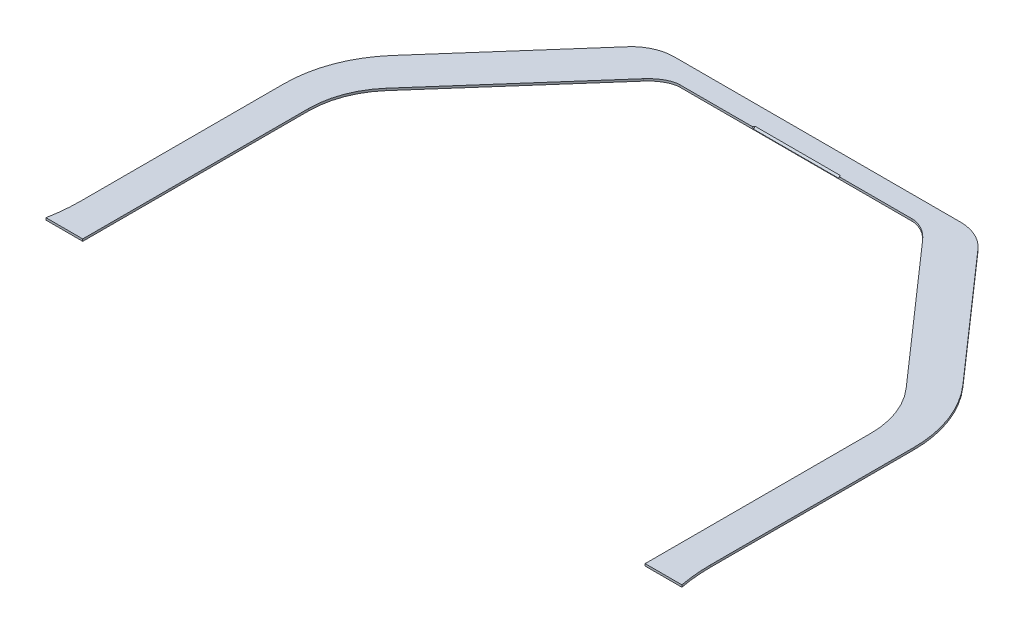
ISO-10303-21;
HEADER;
FILE_DESCRIPTION(('STEP AP214'),'2;1');
FILE_NAME('part.step','',(''),(''),'','','');
FILE_SCHEMA(('AUTOMOTIVE_DESIGN { 1 0 10303 214 1 1 1 1 }'));
ENDSEC;
DATA;
#1=APPLICATION_CONTEXT('core data for automotive mechanical design processes');
#2=APPLICATION_PROTOCOL_DEFINITION('international standard','automotive_design',2000,#1);
#3=PRODUCT_CONTEXT('',#1,'mechanical');
#4=PRODUCT('Part','Part','',(#3));
#5=PRODUCT_RELATED_PRODUCT_CATEGORY('part','',(#4));
#6=PRODUCT_DEFINITION_FORMATION('','',#4);
#7=PRODUCT_DEFINITION_CONTEXT('part definition',#1,'design');
#8=PRODUCT_DEFINITION('design','',#6,#7);
#9=PRODUCT_DEFINITION_SHAPE('','',#8);
#10=(LENGTH_UNIT() NAMED_UNIT(*) SI_UNIT(.MILLI.,.METRE.));
#11=(NAMED_UNIT(*) PLANE_ANGLE_UNIT() SI_UNIT($,.RADIAN.));
#12=(NAMED_UNIT(*) SI_UNIT($,.STERADIAN.) SOLID_ANGLE_UNIT());
#13=UNCERTAINTY_MEASURE_WITH_UNIT(LENGTH_MEASURE(1.E-05),#10,'distance_accuracy_value','');
#14=(GEOMETRIC_REPRESENTATION_CONTEXT(3) GLOBAL_UNCERTAINTY_ASSIGNED_CONTEXT((#13)) GLOBAL_UNIT_ASSIGNED_CONTEXT((#10,
#11,#12)) REPRESENTATION_CONTEXT('',''));
#15=CARTESIAN_POINT('',(0.,0.,0.));
#16=DIRECTION('',(0.,0.,1.));
#17=DIRECTION('',(1.,0.,0.));
#18=AXIS2_PLACEMENT_3D('',#15,#16,#17);
#19=CARTESIAN_POINT('',(136.933846734261,379.769666648598,209.045625837407));
#20=DIRECTION('',(0.707106781186548,-0.499999999999999,-0.5));
#21=DIRECTION('',(-0.577350269189626,0.,-0.816496580927726));
#22=AXIS2_PLACEMENT_3D('',#19,#20,#21);
#23=PLANE('',#22);
#24=DIRECTION('',(-0.577350269188909,0.,-0.816496580928233));
#25=VECTOR('',#24,1.);
#26=CARTESIAN_POINT('',(137.202858372651,376.000087185113,213.19564520834));
#27=LINE('',#26,#25);
#28=CARTESIAN_POINT('',(137.202858372651,376.000087185113,213.19564520834));
#29=VERTEX_POINT('',#28);
#30=CARTESIAN_POINT('',(136.933846734261,376.000087185113,212.815205300892));
#31=VERTEX_POINT('',#30);
#32=EDGE_CURVE('E208',#29,#31,#27,.T.);
#33=ORIENTED_EDGE('',*,*,#32,.T.);
#34=DIRECTION('',(0.,0.707106781186548,-0.707106781186548));
#35=VECTOR('',#34,1.);
#36=CARTESIAN_POINT('',(136.933846734261,379.769666648598,209.045625837407));
#37=LINE('',#36,#35);
#38=CARTESIAN_POINT('',(136.933846734261,375.619647277665,213.19564520834));
#39=VERTEX_POINT('',#38);
#40=EDGE_CURVE('E191',#31,#39,#37,.F.);
#41=ORIENTED_EDGE('',*,*,#40,.T.);
#42=DIRECTION('',(-0.577350269188993,-0.816496580928173,0.));
#43=VECTOR('',#42,1.);
#44=CARTESIAN_POINT('',(137.202858372651,376.000087185113,213.19564520834));
#45=LINE('',#44,#43);
#46=EDGE_CURVE('E194',#29,#39,#45,.T.);
#47=ORIENTED_EDGE('',*,*,#46,.F.);
#48=EDGE_LOOP('',(#33,#41,#47));
#49=FACE_BOUND('',#48,.T.);
#50=ADVANCED_FACE('F17',(#49),#23,.F.);
#51=CARTESIAN_POINT('',(117.066314366113,379.769666648598,209.045625837407));
#52=DIRECTION('',(0.,-0.707106781186548,-0.707106781186548));
#53=DIRECTION('',(0.,0.707106781186548,-0.707106781186548));
#54=AXIS2_PLACEMENT_3D('',#51,#52,#53);
#55=PLANE('',#54);
#56=ORIENTED_EDGE('',*,*,#40,.F.);
#57=DIRECTION('',(1.,0.,0.));
#58=VECTOR('',#57,1.);
#59=CARTESIAN_POINT('',(127.000080550187,376.000087185113,212.815205300892));
#60=LINE('',#59,#58);
#61=CARTESIAN_POINT('',(117.066314366113,376.000087185113,212.815205300892));
#62=VERTEX_POINT('',#61);
#63=EDGE_CURVE('E292',#31,#62,#60,.F.);
#64=ORIENTED_EDGE('',*,*,#63,.T.);
#65=DIRECTION('',(0.,-0.707106781186496,0.707106781186599));
#66=VECTOR('',#65,1.);
#67=CARTESIAN_POINT('',(117.066314366113,376.000087185113,212.815205300892));
#68=LINE('',#67,#66);
#69=CARTESIAN_POINT('',(117.066314366113,375.619647277665,213.19564520834));
#70=VERTEX_POINT('',#69);
#71=EDGE_CURVE('E299',#62,#70,#68,.T.);
#72=ORIENTED_EDGE('',*,*,#71,.T.);
#73=DIRECTION('',(1.,0.,0.));
#74=VECTOR('',#73,1.);
#75=CARTESIAN_POINT('',(154.160725180053,375.619647277665,213.19564520834));
#76=LINE('',#75,#74);
#77=EDGE_CURVE('E288',#39,#70,#76,.F.);
#78=ORIENTED_EDGE('',*,*,#77,.F.);
#79=EDGE_LOOP('',(#56,#64,#72,#78));
#80=FACE_BOUND('',#79,.T.);
#81=ADVANCED_FACE('F476',(#80),#55,.F.);
#82=CARTESIAN_POINT('',(107.90819745815,386.245433217117,215.521392405927));
#83=DIRECTION('',(-0.707106781186547,-0.500000000000001,-0.5));
#84=DIRECTION('',(0.577350269189627,-0.816496580927725,0.));
#85=AXIS2_PLACEMENT_3D('',#82,#83,#84);
#86=PLANE('',#85);
#87=ORIENTED_EDGE('',*,*,#71,.F.);
#88=DIRECTION('',(-0.577350269188929,0.,0.816496580928219));
#89=VECTOR('',#88,1.);
#90=CARTESIAN_POINT('',(117.066314366113,376.000087185113,212.815205300892));
#91=LINE('',#90,#89);
#92=CARTESIAN_POINT('',(116.797302727723,376.000087185113,213.19564520834));
#93=VERTEX_POINT('',#92);
#94=EDGE_CURVE('E175',#62,#93,#91,.T.);
#95=ORIENTED_EDGE('',*,*,#94,.T.);
#96=DIRECTION('',(-0.577350269189013,0.816496580928159,0.));
#97=VECTOR('',#96,1.);
#98=CARTESIAN_POINT('',(117.066314366113,375.619647277665,213.19564520834));
#99=LINE('',#98,#97);
#100=EDGE_CURVE('E277',#70,#93,#99,.T.);
#101=ORIENTED_EDGE('',*,*,#100,.F.);
#102=EDGE_LOOP('',(#87,#95,#101));
#103=FACE_BOUND('',#102,.T.);
#104=ADVANCED_FACE('F473',(#103),#86,.F.);
#105=CARTESIAN_POINT('',(127.000080550187,376.000087185113,280.049829269519));
#106=DIRECTION('',(0.,-1.,0.));
#107=DIRECTION('',(1.,0.,0.));
#108=AXIS2_PLACEMENT_3D('',#105,#106,#107);
#109=PLANE('',#108);
#110=DIRECTION('',(1.,0.,0.));
#111=VECTOR('',#110,1.);
#112=CARTESIAN_POINT('',(154.160725180053,376.000087185113,213.19564520834));
#113=LINE('',#112,#111);
#114=CARTESIAN_POINT('',(154.160725180053,376.000087185113,213.19564520834));
#115=VERTEX_POINT('',#114);
#116=EDGE_CURVE('E212',#115,#29,#113,.F.);
#117=ORIENTED_EDGE('',*,*,#116,.F.);
#118=CARTESIAN_POINT('',(154.160725180053,376.000087185113,213.19564520834));
#119=CARTESIAN_POINT('',(154.262460285647,376.000087185113,213.195657906851));
#120=CARTESIAN_POINT('',(154.364120166583,376.000087185113,213.199601396453));
#121=CARTESIAN_POINT('',(154.566796880058,376.000087185113,213.214611900631));
#122=CARTESIAN_POINT('',(154.667814343037,376.000087185113,213.225670268553));
#123=CARTESIAN_POINT('',(154.967929438156,376.000087185113,213.26820123869));
#124=CARTESIAN_POINT('',(155.165724729044,376.000087185113,213.30905408337));
#125=CARTESIAN_POINT('',(155.540017833539,376.000087185113,213.407121446668));
#126=CARTESIAN_POINT('',(155.716947775557,376.000087185113,213.462752906689));
#127=CARTESIAN_POINT('',(156.065587229689,376.000087185113,213.588648321069));
#128=CARTESIAN_POINT('',(156.237294101393,376.000087185113,213.658919539854));
#129=CARTESIAN_POINT('',(156.576590096595,376.000087185113,213.812687916555));
#130=CARTESIAN_POINT('',(156.744124898625,376.000087185113,213.896303905185));
#131=CARTESIAN_POINT('',(157.073192869577,376.000087185113,214.074622213163));
#132=CARTESIAN_POINT('',(157.234725121922,376.000087185113,214.169326216537));
#133=CARTESIAN_POINT('',(157.535260997122,376.000087185113,214.358230365262));
#134=CARTESIAN_POINT('',(157.67486919109,376.000087185113,214.451473842261));
#135=CARTESIAN_POINT('',(157.949086202793,376.000087185113,214.645115045541));
#136=CARTESIAN_POINT('',(158.083693553515,376.000087185113,214.745514846332));
#137=CARTESIAN_POINT('',(158.347821653437,376.000087185113,214.952873733061));
#138=CARTESIAN_POINT('',(158.477340689966,376.000087185113,215.059834997008));
#139=CARTESIAN_POINT('',(158.728434210269,376.000087185113,215.277448354507));
#140=CARTESIAN_POINT('',(158.850119217999,376.000087185113,215.387973079838));
#141=CARTESIAN_POINT('',(159.088301266345,376.000087185113,215.614370957318));
#142=CARTESIAN_POINT('',(159.204800587149,376.000087185113,215.730241712206));
#143=CARTESIAN_POINT('',(159.432379047297,376.000087185113,215.96693767329));
#144=CARTESIAN_POINT('',(159.543464171324,376.000087185113,216.087757124265));
#145=CARTESIAN_POINT('',(159.651829467432,376.000087185113,216.210962836589));
#146=B_SPLINE_CURVE_WITH_KNOTS('',3,(#118,#119,#120,#121,#122,#123,#124,#125,#126,#127,#128,
#129,#130,#131,#132,#133,#134,#135,#136,#137,#138,#139,#140,#141,#142,#143,#144,#145),
.UNSPECIFIED.,.F.,.F.,(4,2,2,2,2,2,2,2,2,2,2,2,2,4),(0.,0.305010434220096,0.609650890157527,
1.21406500426163,1.76979197699951,2.32579536784298,2.8870586448757,3.4484072763154,
3.95182336903746,4.45538599264022,4.95911668257461,5.45210409213304,5.94487254554009,
6.43708334541167),.UNSPECIFIED.);
#147=CARTESIAN_POINT('',(159.651829467432,376.000087185113,216.210962836589));
#148=VERTEX_POINT('',#147);
#149=EDGE_CURVE('E20',#115,#148,#146,.T.);
#150=ORIENTED_EDGE('',*,*,#149,.T.);
#151=DIRECTION('',(0.660384970753068,0.,0.750927220443812));
#152=VECTOR('',#151,1.);
#153=CARTESIAN_POINT('',(187.818624959063,376.000087185113,248.239574001406));
#154=LINE('',#153,#152);
#155=CARTESIAN_POINT('',(187.818624959063,376.000087185113,248.239574001406));
#156=VERTEX_POINT('',#155);
#157=EDGE_CURVE('E199',#156,#148,#154,.F.);
#158=ORIENTED_EDGE('',*,*,#157,.F.);
#159=CARTESIAN_POINT('',(172.800080550187,376.000087185113,261.447273416467));
#160=DIRECTION('',(0.,-1.,0.));
#161=DIRECTION('',(0.,0.,-1.));
#162=AXIS2_PLACEMENT_3D('',#159,#160,#161);
#163=CIRCLE('',#162,20.);
#164=CARTESIAN_POINT('',(192.800080550187,376.000087185113,261.447273416467));
#165=VERTEX_POINT('',#164);
#166=EDGE_CURVE('E485',#156,#165,#163,.T.);
#167=ORIENTED_EDGE('',*,*,#166,.T.);
#168=DIRECTION('',(0.,0.,1.));
#169=VECTOR('',#168,1.);
#170=CARTESIAN_POINT('',(192.800080550187,376.000087185113,314.303999999904));
#171=LINE('',#170,#169);
#172=CARTESIAN_POINT('',(192.800080550187,376.000087185113,314.303999999904));
#173=VERTEX_POINT('',#172);
#174=EDGE_CURVE('E223',#173,#165,#171,.F.);
#175=ORIENTED_EDGE('',*,*,#174,.F.);
#176=DIRECTION('',(1.,0.,0.));
#177=VECTOR('',#176,1.);
#178=CARTESIAN_POINT('',(201.398389908126,376.000087185113,314.303999999904));
#179=LINE('',#178,#177);
#180=CARTESIAN_POINT('',(201.398389908126,376.000087185113,314.303999999904));
#181=VERTEX_POINT('',#180);
#182=EDGE_CURVE('E229',#181,#173,#179,.F.);
#183=ORIENTED_EDGE('',*,*,#182,.F.);
#184=CARTESIAN_POINT('',(240.700080550187,376.000087185113,306.862420014731));
#185=DIRECTION('',(0.,-1.,0.));
#186=DIRECTION('',(0.,0.,-1.));
#187=AXIS2_PLACEMENT_3D('',#184,#185,#186);
#188=CIRCLE('',#187,40.);
#189=CARTESIAN_POINT('',(200.700080550187,376.000087185113,306.862420014731));
#190=VERTEX_POINT('',#189);
#191=EDGE_CURVE('E232',#181,#190,#188,.T.);
#192=ORIENTED_EDGE('',*,*,#191,.T.);
#193=DIRECTION('',(0.,0.,-1.));
#194=VECTOR('',#193,1.);
#195=CARTESIAN_POINT('',(200.700080550187,376.000087185113,259.327297853723));
#196=LINE('',#195,#194);
#197=CARTESIAN_POINT('',(200.700080550187,376.000087185113,259.327297853723));
#198=VERTEX_POINT('',#197);
#199=EDGE_CURVE('E235',#198,#190,#196,.F.);
#200=ORIENTED_EDGE('',*,*,#199,.F.);
#201=CARTESIAN_POINT('',(172.800080550187,376.000087185113,259.327297853723));
#202=DIRECTION('',(0.,-1.,0.));
#203=DIRECTION('',(0.,0.,-1.));
#204=AXIS2_PLACEMENT_3D('',#201,#202,#203);
#205=CIRCLE('',#204,27.9);
#206=CARTESIAN_POINT('',(193.750950000569,376.000087185113,240.902557169712));
#207=VERTEX_POINT('',#206);
#208=EDGE_CURVE('E502',#207,#198,#205,.T.);
#209=ORIENTED_EDGE('',*,*,#208,.F.);
#210=DIRECTION('',(-0.660384970753068,0.,-0.750927220443812));
#211=VECTOR('',#210,1.);
#212=CARTESIAN_POINT('',(167.974302197033,376.000087185113,211.591795500809));
#213=LINE('',#212,#211);
#214=CARTESIAN_POINT('',(167.974302197033,376.000087185113,211.591795500809));
#215=VERTEX_POINT('',#214);
#216=EDGE_CURVE('E239',#215,#207,#213,.F.);
#217=ORIENTED_EDGE('',*,*,#216,.F.);
#218=CARTESIAN_POINT('',(160.465029992595,376.000087185113,218.19564520834));
#219=DIRECTION('',(0.,-1.,0.));
#220=DIRECTION('',(0.,0.,-1.));
#221=AXIS2_PLACEMENT_3D('',#218,#219,#220);
#222=CIRCLE('',#221,10.0000000000004);
#223=CARTESIAN_POINT('',(160.465029992595,376.000087185113,208.19564520834));
#224=VERTEX_POINT('',#223);
#225=EDGE_CURVE('E507',#224,#215,#222,.T.);
#226=ORIENTED_EDGE('',*,*,#225,.F.);
#227=DIRECTION('',(-1.,0.,0.));
#228=VECTOR('',#227,1.);
#229=CARTESIAN_POINT('',(93.5351311077796,376.000087185113,208.19564520834));
#230=LINE('',#229,#228);
#231=CARTESIAN_POINT('',(93.5351311077796,376.000087185113,208.19564520834));
#232=VERTEX_POINT('',#231);
#233=EDGE_CURVE('E244',#232,#224,#230,.F.);
#234=ORIENTED_EDGE('',*,*,#233,.F.);
#235=CARTESIAN_POINT('',(93.5351311077797,376.000087185113,218.19564520834));
#236=DIRECTION('',(0.,-1.,0.));
#237=DIRECTION('',(0.,0.,-1.));
#238=AXIS2_PLACEMENT_3D('',#235,#236,#237);
#239=CIRCLE('',#238,10.0000000000001);
#240=CARTESIAN_POINT('',(86.0258589033417,376.000087185113,211.591795500809));
#241=VERTEX_POINT('',#240);
#242=EDGE_CURVE('E512',#241,#232,#239,.T.);
#243=ORIENTED_EDGE('',*,*,#242,.F.);
#244=DIRECTION('',(-0.660384970753068,0.,0.750927220443812));
#245=VECTOR('',#244,1.);
#246=CARTESIAN_POINT('',(60.2492110998048,376.000087185113,240.902557169713));
#247=LINE('',#246,#245);
#248=CARTESIAN_POINT('',(60.249211099805,376.000087185113,240.902557169713));
#249=VERTEX_POINT('',#248);
#250=EDGE_CURVE('E249',#249,#241,#247,.F.);
#251=ORIENTED_EDGE('',*,*,#250,.F.);
#252=CARTESIAN_POINT('',(81.2000805501871,376.000087185113,259.327297853723));
#253=DIRECTION('',(0.,-1.,0.));
#254=DIRECTION('',(0.,0.,-1.));
#255=AXIS2_PLACEMENT_3D('',#252,#253,#254);
#256=CIRCLE('',#255,27.9);
#257=CARTESIAN_POINT('',(53.3000805501871,376.000087185113,259.327297853723));
#258=VERTEX_POINT('',#257);
#259=EDGE_CURVE('E517',#258,#249,#256,.T.);
#260=ORIENTED_EDGE('',*,*,#259,.F.);
#261=DIRECTION('',(0.,0.,1.));
#262=VECTOR('',#261,1.);
#263=CARTESIAN_POINT('',(53.3000805501871,376.000087185113,306.862420014451));
#264=LINE('',#263,#262);
#265=CARTESIAN_POINT('',(53.3000805501871,376.000087185113,306.862420014451));
#266=VERTEX_POINT('',#265);
#267=EDGE_CURVE('E254',#266,#258,#264,.F.);
#268=ORIENTED_EDGE('',*,*,#267,.F.);
#269=CARTESIAN_POINT('',(13.3000805501872,376.000087185113,306.862420014451));
#270=DIRECTION('',(0.,-1.,0.));
#271=DIRECTION('',(0.,0.,-1.));
#272=AXIS2_PLACEMENT_3D('',#269,#270,#271);
#273=CIRCLE('',#272,40.);
#274=CARTESIAN_POINT('',(52.6017711921953,376.000087185113,314.303999999904));
#275=VERTEX_POINT('',#274);
#276=EDGE_CURVE('E258',#266,#275,#273,.T.);
#277=ORIENTED_EDGE('',*,*,#276,.T.);
#278=DIRECTION('',(1.,0.,0.));
#279=VECTOR('',#278,1.);
#280=CARTESIAN_POINT('',(61.200080550187,376.000087185113,314.303999999904));
#281=LINE('',#280,#279);
#282=CARTESIAN_POINT('',(61.200080550187,376.000087185113,314.303999999904));
#283=VERTEX_POINT('',#282);
#284=EDGE_CURVE('E259',#283,#275,#281,.F.);
#285=ORIENTED_EDGE('',*,*,#284,.F.);
#286=DIRECTION('',(0.,0.,-1.));
#287=VECTOR('',#286,1.);
#288=CARTESIAN_POINT('',(61.200080550187,376.000087185113,261.447273416468));
#289=LINE('',#288,#287);
#290=CARTESIAN_POINT('',(61.200080550187,376.000087185113,261.447273416468));
#291=VERTEX_POINT('',#290);
#292=EDGE_CURVE('E265',#291,#283,#289,.F.);
#293=ORIENTED_EDGE('',*,*,#292,.F.);
#294=CARTESIAN_POINT('',(81.200080550187,376.000087185113,261.447273416467));
#295=DIRECTION('',(0.,-1.,0.));
#296=DIRECTION('',(0.,0.,-1.));
#297=AXIS2_PLACEMENT_3D('',#294,#295,#296);
#298=CIRCLE('',#297,20.);
#299=CARTESIAN_POINT('',(66.1815361413109,376.000087185113,248.239574001406));
#300=VERTEX_POINT('',#299);
#301=EDGE_CURVE('E268',#291,#300,#298,.T.);
#302=ORIENTED_EDGE('',*,*,#301,.T.);
#303=DIRECTION('',(0.660384970753083,0.,-0.750927220443799));
#304=VECTOR('',#303,1.);
#305=CARTESIAN_POINT('',(94.348331632942,376.000087185113,216.210962836589));
#306=LINE('',#305,#304);
#307=CARTESIAN_POINT('',(94.348331632942,376.000087185113,216.210962836589));
#308=VERTEX_POINT('',#307);
#309=EDGE_CURVE('E271',#308,#300,#306,.F.);
#310=ORIENTED_EDGE('',*,*,#309,.F.);
#311=CARTESIAN_POINT('',(94.348331632942,376.000087185113,216.210962836589));
#312=CARTESIAN_POINT('',(94.4800864953319,376.000087185113,216.061181367861));
#313=CARTESIAN_POINT('',(94.6158561620775,376.000087185113,215.914909215602));
#314=CARTESIAN_POINT('',(94.8964126143941,376.000087185113,215.628676878174));
#315=CARTESIAN_POINT('',(95.0412698906349,376.000087185113,215.488785804038));
#316=CARTESIAN_POINT('',(95.3233594070541,376.000087185113,215.231251187367));
#317=CARTESIAN_POINT('',(95.4598517011271,376.000087185113,215.11279688855));
#318=CARTESIAN_POINT('',(95.7388874196425,376.000087185113,214.883117548601));
#319=CARTESIAN_POINT('',(95.8814331391746,376.000087185113,214.771895290609));
#320=CARTESIAN_POINT('',(96.1724611415316,376.000087185113,214.55737980286));
#321=CARTESIAN_POINT('',(96.3209455289623,376.000087185113,214.454089422636));
#322=CARTESIAN_POINT('',(96.6225896911089,376.000087185113,214.25707013892));
#323=CARTESIAN_POINT('',(96.775707057864,376.000087185113,214.163276512351));
#324=CARTESIAN_POINT('',(97.0874861987249,376.000087185113,213.985483215366));
#325=CARTESIAN_POINT('',(97.2461464009655,376.000087185113,213.901480797146));
#326=CARTESIAN_POINT('',(97.568871970215,376.000087185113,213.74459697832));
#327=CARTESIAN_POINT('',(97.7329358409912,376.000087185113,213.671712530195));
#328=CARTESIAN_POINT('',(98.0018972197336,376.000087185113,213.564435949913));
#329=CARTESIAN_POINT('',(98.1052073219126,376.000087185113,213.526040210729));
#330=CARTESIAN_POINT('',(98.3136187558285,376.000087185113,213.454606755634));
#331=CARTESIAN_POINT('',(98.4187191660477,376.000087185113,213.421566370099));
#332=CARTESIAN_POINT('',(98.6305068480643,376.000087185113,213.361423747947));
#333=CARTESIAN_POINT('',(98.7371925111899,376.000087185113,213.334315879194));
#334=CARTESIAN_POINT('',(98.9532397217419,376.000087185113,213.286399468833));
#335=CARTESIAN_POINT('',(99.0626178677371,376.000087185113,213.265665157398));
#336=CARTESIAN_POINT('',(99.282669170316,376.000087185113,213.231691067338));
#337=CARTESIAN_POINT('',(99.3933434891425,376.000087185113,213.218458640575));
#338=CARTESIAN_POINT('',(99.6157954951505,376.000087185113,213.200428982652));
#339=CARTESIAN_POINT('',(99.727575791829,376.000087185113,213.195664491312));
#340=CARTESIAN_POINT('',(99.8394359203215,376.000087185113,213.19564520834));
#341=B_SPLINE_CURVE_WITH_KNOTS('',3,(#311,#312,#313,#314,#315,#316,#317,#318,#319,#320,#321,
#322,#323,#324,#325,#326,#327,#328,#329,#330,#331,#332,#333,#334,#335,#336,#337,#338,#339,#340),
.UNSPECIFIED.,.F.,.F.,(4,2,2,2,2,2,2,2,2,2,2,2,2,2,4),(0.,0.598408115521807,1.20223233714768,
1.74417536911627,2.28632574004247,2.82866997644004,3.36702621406335,3.90523100182788,
4.44328799751759,4.77380847535047,5.10416367980367,5.43420388207642,5.76795378366559,
6.1020301979058,6.43739547435884),.UNSPECIFIED.);
#342=CARTESIAN_POINT('',(99.8394359203215,376.000087185113,213.19564520834));
#343=VERTEX_POINT('',#342);
#344=EDGE_CURVE('E274',#308,#343,#341,.T.);
#345=ORIENTED_EDGE('',*,*,#344,.T.);
#346=DIRECTION('',(1.,0.,0.));
#347=VECTOR('',#346,1.);
#348=CARTESIAN_POINT('',(154.160725180053,376.000087185113,213.19564520834));
#349=LINE('',#348,#347);
#350=EDGE_CURVE('E275',#93,#343,#349,.F.);
#351=ORIENTED_EDGE('',*,*,#350,.F.);
#352=ORIENTED_EDGE('',*,*,#94,.F.);
#353=ORIENTED_EDGE('',*,*,#63,.F.);
#354=ORIENTED_EDGE('',*,*,#32,.F.);
#355=EDGE_LOOP('',(#117,#150,#158,#167,#175,#183,#192,#200,#209,#217,#226,#234,#243,#251,#260,
#268,#277,#285,#293,#302,#310,#345,#351,#352,#353,#354));
#356=FACE_BOUND('',#355,.T.);
#357=ADVANCED_FACE('F210',(#356),#109,.F.);
#358=CARTESIAN_POINT('',(187.818624959063,376.000087185113,248.239574001406));
#359=DIRECTION('',(-0.750927220443812,0.,0.660384970753068));
#360=DIRECTION('',(0.660384970753068,0.,0.750927220443812));
#361=AXIS2_PLACEMENT_3D('',#358,#359,#360);
#362=PLANE('',#361);
#363=DIRECTION('',(-0.66038497075308,0.,-0.750927220443801));
#364=VECTOR('',#363,1.);
#365=CARTESIAN_POINT('',(187.818624959063,375.500087185113,248.239574001406));
#366=LINE('',#365,#364);
#367=CARTESIAN_POINT('',(187.818624959063,375.500087185113,248.239574001406));
#368=VERTEX_POINT('',#367);
#369=CARTESIAN_POINT('',(159.651829467432,375.500087185113,216.210962836589));
#370=VERTEX_POINT('',#369);
#371=EDGE_CURVE('E484',#368,#370,#366,.T.);
#372=ORIENTED_EDGE('',*,*,#371,.F.);
#373=DIRECTION('',(0.,-1.,0.));
#374=VECTOR('',#373,1.);
#375=CARTESIAN_POINT('',(187.818624959063,376.000087185113,248.239574001406));
#376=LINE('',#375,#374);
#377=EDGE_CURVE('E204',#368,#156,#376,.F.);
#378=ORIENTED_EDGE('',*,*,#377,.T.);
#379=ORIENTED_EDGE('',*,*,#157,.T.);
#380=DIRECTION('',(0.,-1.,0.));
#381=VECTOR('',#380,1.);
#382=CARTESIAN_POINT('',(159.651829467432,375.700087185113,216.210962836589));
#383=LINE('',#382,#381);
#384=EDGE_CURVE('E201',#148,#370,#383,.T.);
#385=ORIENTED_EDGE('',*,*,#384,.T.);
#386=EDGE_LOOP('',(#372,#378,#379,#385));
#387=FACE_BOUND('',#386,.T.);
#388=ADVANCED_FACE('F200',(#387),#362,.T.);
#389=CARTESIAN_POINT('',(154.160725180053,376.000087185113,213.19564520834));
#390=CARTESIAN_POINT('',(154.160725180053,375.400087185113,213.19564520834));
#391=CARTESIAN_POINT('',(157.00008264392,376.000087185113,213.19564520834));
#392=CARTESIAN_POINT('',(157.00008264392,375.400087185113,213.19564520834));
#393=CARTESIAN_POINT('',(159.651829467432,376.000087185113,216.210962836589));
#394=CARTESIAN_POINT('',(159.651829467432,375.400087185113,216.210962836589));
#395=(BOUNDED_SURFACE() B_SPLINE_SURFACE(2,1,((#389,#390),(#391,#392),(#393,#394)),
.UNSPECIFIED.,.F.,.F.,.F.) B_SPLINE_SURFACE_WITH_KNOTS((3,3),(2,2),(0.485852856982718,
1.57079697885826),(0.,0.0599999999999966),
.UNSPECIFIED.) GEOMETRIC_REPRESENTATION_ITEM() RATIONAL_B_SPLINE_SURFACE(((1.,1.),
(0.85643508639255,0.85643508639255),(1.,1.))) REPRESENTATION_ITEM('') SURFACE());
#396=DIRECTION('',(0.,1.,0.));
#397=VECTOR('',#396,1.);
#398=CARTESIAN_POINT('',(154.160725180053,376.000087185113,213.19564520834));
#399=LINE('',#398,#397);
#400=CARTESIAN_POINT('',(154.160725180053,375.500087185113,213.19564520834));
#401=VERTEX_POINT('',#400);
#402=EDGE_CURVE('E220',#401,#115,#399,.T.);
#403=CARTESIAN_POINT('',(159.651829467432,375.500087185113,216.210962836589));
#404=CARTESIAN_POINT('',(159.520074605042,375.500087185113,216.061181367861));
#405=CARTESIAN_POINT('',(159.384304938297,375.500087185113,215.914909215602));
#406=CARTESIAN_POINT('',(159.10374848598,375.500087185113,215.628676878174));
#407=CARTESIAN_POINT('',(158.958891209739,375.500087185113,215.488785804038));
#408=CARTESIAN_POINT('',(158.67680169332,375.500087185113,215.231251187367));
#409=CARTESIAN_POINT('',(158.540309399247,375.500087185113,215.11279688855));
#410=CARTESIAN_POINT('',(158.261273680732,375.500087185113,214.883117548601));
#411=CARTESIAN_POINT('',(158.118727961199,375.500087185113,214.771895290609));
#412=CARTESIAN_POINT('',(157.827699958842,375.500087185113,214.55737980286));
#413=CARTESIAN_POINT('',(157.679215571412,375.500087185113,214.454089422636));
#414=CARTESIAN_POINT('',(157.377571409265,375.500087185113,214.25707013892));
#415=CARTESIAN_POINT('',(157.22445404251,375.500087185113,214.163276512351));
#416=CARTESIAN_POINT('',(156.912674901649,375.500087185113,213.985483215365));
#417=CARTESIAN_POINT('',(156.754014699408,375.500087185113,213.901480797146));
#418=CARTESIAN_POINT('',(156.431289130159,375.500087185113,213.744596978319));
#419=CARTESIAN_POINT('',(156.267225259383,375.500087185113,213.671712530195));
#420=CARTESIAN_POINT('',(155.99826388064,375.500087185113,213.564435949913));
#421=CARTESIAN_POINT('',(155.894953778461,375.500087185113,213.526040210729));
#422=CARTESIAN_POINT('',(155.686542344546,375.500087185113,213.454606755634));
#423=CARTESIAN_POINT('',(155.581441934326,375.500087185113,213.421566370099));
#424=CARTESIAN_POINT('',(155.36965425231,375.500087185113,213.361423747947));
#425=CARTESIAN_POINT('',(155.262968589184,375.500087185113,213.334315879194));
#426=CARTESIAN_POINT('',(155.046921378632,375.500087185113,213.286399468833));
#427=CARTESIAN_POINT('',(154.937543232637,375.500087185113,213.265665157398));
#428=CARTESIAN_POINT('',(154.717491930058,375.500087185113,213.231691067338));
#429=CARTESIAN_POINT('',(154.606817611232,375.500087185113,213.218458640575));
#430=CARTESIAN_POINT('',(154.384365605224,375.500087185113,213.200428982652));
#431=CARTESIAN_POINT('',(154.272585308545,375.500087185113,213.195664491312));
#432=CARTESIAN_POINT('',(154.160725180053,375.500087185113,213.19564520834));
#433=B_SPLINE_CURVE_WITH_KNOTS('',3,(#403,#404,#405,#406,#407,#408,#409,#410,#411,#412,#413,
#414,#415,#416,#417,#418,#419,#420,#421,#422,#423,#424,#425,#426,#427,#428,#429,#430,#431,#432),
.UNSPECIFIED.,.F.,.F.,(4,2,2,2,2,2,2,2,2,2,2,2,2,2,4),(0.,0.598408115521788,1.20223233714765,
1.74417536911628,2.28632574004256,2.82866997644018,3.36702621406352,3.90523100182808,
4.44328799751783,4.77380847535063,5.10416367980368,5.4342038820763,5.76795378366541,
6.10203019790543,6.43739547435838),.UNSPECIFIED.);
#434=EDGE_CURVE('E216',#370,#401,#433,.T.);
#435=ORIENTED_EDGE('',*,*,#402,.F.);
#436=ORIENTED_EDGE('',*,*,#434,.F.);
#437=ORIENTED_EDGE('',*,*,#384,.F.);
#438=ORIENTED_EDGE('',*,*,#149,.F.);
#439=EDGE_LOOP('',(#435,#436,#437,#438));
#440=FACE_BOUND('',#439,.T.);
#441=ADVANCED_FACE('F214',(#440),#395,.F.);
#442=CARTESIAN_POINT('',(154.160725180053,376.000087185113,213.19564520834));
#443=DIRECTION('',(0.,0.,1.));
#444=DIRECTION('',(1.,0.,0.));
#445=AXIS2_PLACEMENT_3D('',#442,#443,#444);
#446=PLANE('',#445);
#447=ORIENTED_EDGE('',*,*,#402,.T.);
#448=ORIENTED_EDGE('',*,*,#116,.T.);
#449=ORIENTED_EDGE('',*,*,#46,.T.);
#450=ORIENTED_EDGE('',*,*,#77,.T.);
#451=ORIENTED_EDGE('',*,*,#100,.T.);
#452=ORIENTED_EDGE('',*,*,#350,.T.);
#453=DIRECTION('',(0.,-1.,0.));
#454=VECTOR('',#453,1.);
#455=CARTESIAN_POINT('',(99.8394359203215,375.700087185113,213.19564520834));
#456=LINE('',#455,#454);
#457=CARTESIAN_POINT('',(99.8394359203215,375.500087185113,213.19564520834));
#458=VERTEX_POINT('',#457);
#459=EDGE_CURVE('E281',#343,#458,#456,.T.);
#460=ORIENTED_EDGE('',*,*,#459,.T.);
#461=DIRECTION('',(1.,0.,0.));
#462=VECTOR('',#461,1.);
#463=CARTESIAN_POINT('',(127.000080550187,375.500087185113,213.19564520834));
#464=LINE('',#463,#462);
#465=EDGE_CURVE('E352',#401,#458,#464,.F.);
#466=ORIENTED_EDGE('',*,*,#465,.F.);
#467=EDGE_LOOP('',(#447,#448,#449,#450,#451,#452,#460,#466));
#468=FACE_BOUND('',#467,.T.);
#469=ADVANCED_FACE('F443',(#468),#446,.T.);
#470=CARTESIAN_POINT('',(94.348331632942,376.000087185113,216.210962836589));
#471=CARTESIAN_POINT('',(94.348331632942,375.400087185113,216.210962836589));
#472=CARTESIAN_POINT('',(97.000078456454,376.000087185113,213.19564520834));
#473=CARTESIAN_POINT('',(97.000078456454,375.400087185113,213.19564520834));
#474=CARTESIAN_POINT('',(99.8394359203215,376.000087185113,213.19564520834));
#475=CARTESIAN_POINT('',(99.8394359203215,375.400087185113,213.19564520834));
#476=(BOUNDED_SURFACE() B_SPLINE_SURFACE(2,1,((#470,#471),(#472,#473),(#474,#475)),
.UNSPECIFIED.,.F.,.F.,.F.) B_SPLINE_SURFACE_WITH_KNOTS((3,3),(2,2),(-1.57079697885826,
-0.485852856982719),(0.,0.0599999999999966),
.UNSPECIFIED.) GEOMETRIC_REPRESENTATION_ITEM() RATIONAL_B_SPLINE_SURFACE(((1.,1.),
(0.856435086392548,0.856435086392548),(1.,1.))) REPRESENTATION_ITEM('') SURFACE());
#477=DIRECTION('',(0.,1.,0.));
#478=VECTOR('',#477,1.);
#479=CARTESIAN_POINT('',(94.348331632942,376.000087185113,216.210962836589));
#480=LINE('',#479,#478);
#481=CARTESIAN_POINT('',(94.348331632942,375.500087185113,216.210962836589));
#482=VERTEX_POINT('',#481);
#483=EDGE_CURVE('E273',#482,#308,#480,.T.);
#484=CARTESIAN_POINT('',(99.8394359203215,375.500087185113,213.19564520834));
#485=CARTESIAN_POINT('',(99.7377008147274,375.500087185113,213.195657906851));
#486=CARTESIAN_POINT('',(99.6360409337918,375.500087185113,213.199601396453));
#487=CARTESIAN_POINT('',(99.4333642203164,375.500087185113,213.214611900631));
#488=CARTESIAN_POINT('',(99.3323467573371,375.500087185113,213.225670268553));
#489=CARTESIAN_POINT('',(99.0322316622188,375.500087185113,213.26820123869));
#490=CARTESIAN_POINT('',(98.8344363713309,375.500087185113,213.30905408337));
#491=CARTESIAN_POINT('',(98.4601432668358,375.500087185113,213.407121446668));
#492=CARTESIAN_POINT('',(98.2832133248176,375.500087185113,213.462752906689));
#493=CARTESIAN_POINT('',(97.934573870685,375.500087185113,213.588648321069));
#494=CARTESIAN_POINT('',(97.7628669989813,375.500087185113,213.658919539854));
#495=CARTESIAN_POINT('',(97.4235710037794,375.500087185113,213.812687916555));
#496=CARTESIAN_POINT('',(97.256036201749,375.500087185113,213.896303905185));
#497=CARTESIAN_POINT('',(96.9269682307972,375.500087185113,214.074622213164));
#498=CARTESIAN_POINT('',(96.765435978452,375.500087185113,214.169326216537));
#499=CARTESIAN_POINT('',(96.4649001032524,375.500087185113,214.358230365262));
#500=CARTESIAN_POINT('',(96.3252919092836,375.500087185113,214.451473842261));
#501=CARTESIAN_POINT('',(96.0510748975809,375.500087185113,214.645115045541));
#502=CARTESIAN_POINT('',(95.9164675468591,375.500087185113,214.745514846332));
#503=CARTESIAN_POINT('',(95.6523394469374,375.500087185113,214.952873733062));
#504=CARTESIAN_POINT('',(95.5228204104082,375.500087185113,215.059834997008));
#505=CARTESIAN_POINT('',(95.2717268901047,375.500087185113,215.277448354507));
#506=CARTESIAN_POINT('',(95.1500418823753,375.500087185113,215.387973079838));
#507=CARTESIAN_POINT('',(94.9118598340292,375.500087185113,215.614370957317));
#508=CARTESIAN_POINT('',(94.7953605132252,375.500087185113,215.730241712206));
#509=CARTESIAN_POINT('',(94.5677820530767,375.500087185113,215.96693767329));
#510=CARTESIAN_POINT('',(94.4566969290499,375.500087185113,216.087757124265));
#511=CARTESIAN_POINT('',(94.348331632942,375.500087185113,216.210962836589));
#512=B_SPLINE_CURVE_WITH_KNOTS('',3,(#484,#485,#486,#487,#488,#489,#490,#491,#492,#493,#494,
#495,#496,#497,#498,#499,#500,#501,#502,#503,#504,#505,#506,#507,#508,#509,#510,#511),
.UNSPECIFIED.,.F.,.F.,(4,2,2,2,2,2,2,2,2,2,2,2,2,4),(0.,0.305010434220096,0.609650890157499,
1.21406500426161,1.76979197699961,2.32579536784322,2.88705864487607,3.44840727631588,
3.95182336903795,4.45538599264069,4.95911668257505,5.45210409213346,5.94487254554049,
6.43708334541209),.UNSPECIFIED.);
#513=EDGE_CURVE('E343',#458,#482,#512,.T.);
#514=ORIENTED_EDGE('',*,*,#483,.F.);
#515=ORIENTED_EDGE('',*,*,#513,.F.);
#516=ORIENTED_EDGE('',*,*,#459,.F.);
#517=ORIENTED_EDGE('',*,*,#344,.F.);
#518=EDGE_LOOP('',(#514,#515,#516,#517));
#519=FACE_BOUND('',#518,.T.);
#520=ADVANCED_FACE('F358',(#519),#476,.F.);
#521=CARTESIAN_POINT('',(94.348331632942,376.000087185113,216.210962836589));
#522=DIRECTION('',(0.750927220443799,0.,0.660384970753083));
#523=DIRECTION('',(0.660384970753083,0.,-0.750927220443799));
#524=AXIS2_PLACEMENT_3D('',#521,#522,#523);
#525=PLANE('',#524);
#526=DIRECTION('',(-0.660384970753084,0.,0.750927220443798));
#527=VECTOR('',#526,1.);
#528=CARTESIAN_POINT('',(94.348331632942,375.500087185113,216.210962836589));
#529=LINE('',#528,#527);
#530=CARTESIAN_POINT('',(66.1815361413109,375.500087185113,248.239574001406));
#531=VERTEX_POINT('',#530);
#532=EDGE_CURVE('E342',#482,#531,#529,.T.);
#533=ORIENTED_EDGE('',*,*,#532,.F.);
#534=ORIENTED_EDGE('',*,*,#483,.T.);
#535=ORIENTED_EDGE('',*,*,#309,.T.);
#536=DIRECTION('',(0.,-1.,0.));
#537=VECTOR('',#536,1.);
#538=CARTESIAN_POINT('',(66.1815361413106,376.000087185113,248.239574001406));
#539=LINE('',#538,#537);
#540=EDGE_CURVE('E449',#300,#531,#539,.T.);
#541=ORIENTED_EDGE('',*,*,#540,.T.);
#542=EDGE_LOOP('',(#533,#534,#535,#541));
#543=FACE_BOUND('',#542,.T.);
#544=ADVANCED_FACE('F435',(#543),#525,.T.);
#545=CARTESIAN_POINT('',(81.200080550187,376.000087185113,261.447273416467));
#546=DIRECTION('',(0.,-1.,0.));
#547=DIRECTION('',(0.,0.,-1.));
#548=AXIS2_PLACEMENT_3D('',#545,#546,#547);
#549=CYLINDRICAL_SURFACE('',#548,20.);
#550=DIRECTION('',(0.,1.,0.));
#551=VECTOR('',#550,1.);
#552=CARTESIAN_POINT('',(61.200080550187,376.000087185113,261.447273416468));
#553=LINE('',#552,#551);
#554=CARTESIAN_POINT('',(61.200080550187,375.500087185113,261.447273416468));
#555=VERTEX_POINT('',#554);
#556=EDGE_CURVE('E262',#555,#291,#553,.T.);
#557=ORIENTED_EDGE('',*,*,#556,.F.);
#558=CARTESIAN_POINT('',(81.200080550187,375.500087185113,261.447273416467));
#559=DIRECTION('',(0.,-1.,0.));
#560=DIRECTION('',(0.,0.,-1.));
#561=AXIS2_PLACEMENT_3D('',#558,#559,#560);
#562=CIRCLE('',#561,20.);
#563=EDGE_CURVE('E338',#531,#555,#562,.F.);
#564=ORIENTED_EDGE('',*,*,#563,.F.);
#565=ORIENTED_EDGE('',*,*,#540,.F.);
#566=ORIENTED_EDGE('',*,*,#301,.F.);
#567=EDGE_LOOP('',(#557,#564,#565,#566));
#568=FACE_BOUND('',#567,.T.);
#569=ADVANCED_FACE('F432',(#568),#549,.F.);
#570=CARTESIAN_POINT('',(61.200080550187,376.000087185113,261.447273416468));
#571=DIRECTION('',(1.,0.,0.));
#572=DIRECTION('',(0.,0.,-1.));
#573=AXIS2_PLACEMENT_3D('',#570,#571,#572);
#574=PLANE('',#573);
#575=DIRECTION('',(0.,0.,1.));
#576=VECTOR('',#575,1.);
#577=CARTESIAN_POINT('',(61.200080550187,375.500087185113,280.049829269519));
#578=LINE('',#577,#576);
#579=CARTESIAN_POINT('',(61.200080550187,375.500087185113,314.303999999904));
#580=VERTEX_POINT('',#579);
#581=EDGE_CURVE('E341',#555,#580,#578,.T.);
#582=ORIENTED_EDGE('',*,*,#581,.F.);
#583=ORIENTED_EDGE('',*,*,#556,.T.);
#584=ORIENTED_EDGE('',*,*,#292,.T.);
#585=DIRECTION('',(0.,1.,0.));
#586=VECTOR('',#585,1.);
#587=CARTESIAN_POINT('',(61.200080550187,376.000087185113,314.303999999904));
#588=LINE('',#587,#586);
#589=EDGE_CURVE('E261',#580,#283,#588,.T.);
#590=ORIENTED_EDGE('',*,*,#589,.F.);
#591=EDGE_LOOP('',(#582,#583,#584,#590));
#592=FACE_BOUND('',#591,.T.);
#593=ADVANCED_FACE('F428',(#592),#574,.T.);
#594=CARTESIAN_POINT('',(61.200080550187,376.000087185113,314.303999999904));
#595=DIRECTION('',(0.,0.,1.));
#596=DIRECTION('',(1.,0.,0.));
#597=AXIS2_PLACEMENT_3D('',#594,#595,#596);
#598=PLANE('',#597);
#599=DIRECTION('',(1.,0.,0.));
#600=VECTOR('',#599,1.);
#601=CARTESIAN_POINT('',(127.000080550187,375.500087185113,314.303999999904));
#602=LINE('',#601,#600);
#603=CARTESIAN_POINT('',(52.6017711921953,375.500087185113,314.303999999904));
#604=VERTEX_POINT('',#603);
#605=EDGE_CURVE('E337',#580,#604,#602,.F.);
#606=ORIENTED_EDGE('',*,*,#605,.F.);
#607=ORIENTED_EDGE('',*,*,#589,.T.);
#608=ORIENTED_EDGE('',*,*,#284,.T.);
#609=DIRECTION('',(0.,-1.,0.));
#610=VECTOR('',#609,1.);
#611=CARTESIAN_POINT('',(52.6017711921953,376.000087185113,314.303999999904));
#612=LINE('',#611,#610);
#613=EDGE_CURVE('E520',#275,#604,#612,.T.);
#614=ORIENTED_EDGE('',*,*,#613,.T.);
#615=EDGE_LOOP('',(#606,#607,#608,#614));
#616=FACE_BOUND('',#615,.T.);
#617=ADVANCED_FACE('F424',(#616),#598,.T.);
#618=CARTESIAN_POINT('',(13.3000805501872,376.000087185113,306.862420014451));
#619=DIRECTION('',(0.,-1.,0.));
#620=DIRECTION('',(0.,0.,-1.));
#621=AXIS2_PLACEMENT_3D('',#618,#619,#620);
#622=CYLINDRICAL_SURFACE('',#621,40.);
#623=DIRECTION('',(0.,1.,0.));
#624=VECTOR('',#623,1.);
#625=CARTESIAN_POINT('',(53.3000805501871,376.000087185113,306.862420014451));
#626=LINE('',#625,#624);
#627=CARTESIAN_POINT('',(53.3000805501871,375.500087185113,306.862420014451));
#628=VERTEX_POINT('',#627);
#629=EDGE_CURVE('E257',#628,#266,#626,.T.);
#630=ORIENTED_EDGE('',*,*,#629,.F.);
#631=CARTESIAN_POINT('',(13.3000805501872,375.500087185113,306.862420014451));
#632=DIRECTION('',(0.,-1.,0.));
#633=DIRECTION('',(0.,0.,-1.));
#634=AXIS2_PLACEMENT_3D('',#631,#632,#633);
#635=CIRCLE('',#634,40.);
#636=EDGE_CURVE('E334',#604,#628,#635,.F.);
#637=ORIENTED_EDGE('',*,*,#636,.F.);
#638=ORIENTED_EDGE('',*,*,#613,.F.);
#639=ORIENTED_EDGE('',*,*,#276,.F.);
#640=EDGE_LOOP('',(#630,#637,#638,#639));
#641=FACE_BOUND('',#640,.T.);
#642=ADVANCED_FACE('F420',(#641),#622,.F.);
#643=CARTESIAN_POINT('',(53.3000805501871,376.000087185113,306.862420014451));
#644=DIRECTION('',(-1.,0.,0.));
#645=DIRECTION('',(0.,0.,1.));
#646=AXIS2_PLACEMENT_3D('',#643,#644,#645);
#647=PLANE('',#646);
#648=DIRECTION('',(0.,0.,1.));
#649=VECTOR('',#648,1.);
#650=CARTESIAN_POINT('',(53.3000805501871,375.500087185113,280.049829269519));
#651=LINE('',#650,#649);
#652=CARTESIAN_POINT('',(53.3000805501871,375.500087185113,259.327297853723));
#653=VERTEX_POINT('',#652);
#654=EDGE_CURVE('E333',#628,#653,#651,.F.);
#655=ORIENTED_EDGE('',*,*,#654,.F.);
#656=ORIENTED_EDGE('',*,*,#629,.T.);
#657=ORIENTED_EDGE('',*,*,#267,.T.);
#658=DIRECTION('',(0.,-1.,0.));
#659=VECTOR('',#658,1.);
#660=CARTESIAN_POINT('',(53.3000805501871,376.000087185113,259.327297853723));
#661=LINE('',#660,#659);
#662=EDGE_CURVE('E253',#653,#258,#661,.F.);
#663=ORIENTED_EDGE('',*,*,#662,.F.);
#664=EDGE_LOOP('',(#655,#656,#657,#663));
#665=FACE_BOUND('',#664,.T.);
#666=ADVANCED_FACE('F416',(#665),#647,.T.);
#667=CARTESIAN_POINT('',(81.2000805501871,376.000087185113,259.327297853723));
#668=DIRECTION('',(0.,-1.,0.));
#669=DIRECTION('',(0.,0.,-1.));
#670=AXIS2_PLACEMENT_3D('',#667,#668,#669);
#671=CYLINDRICAL_SURFACE('',#670,27.9);
#672=CARTESIAN_POINT('',(81.2000805501871,375.500087185113,259.327297853723));
#673=DIRECTION('',(0.,-1.,0.));
#674=DIRECTION('',(0.,0.,-1.));
#675=AXIS2_PLACEMENT_3D('',#672,#673,#674);
#676=CIRCLE('',#675,27.9);
#677=CARTESIAN_POINT('',(60.2492110998048,375.500087185113,240.902557169713));
#678=VERTEX_POINT('',#677);
#679=EDGE_CURVE('E330',#653,#678,#676,.T.);
#680=ORIENTED_EDGE('',*,*,#679,.F.);
#681=ORIENTED_EDGE('',*,*,#662,.T.);
#682=ORIENTED_EDGE('',*,*,#259,.T.);
#683=DIRECTION('',(0.,1.,0.));
#684=VECTOR('',#683,1.);
#685=CARTESIAN_POINT('',(60.2492110998048,376.000087185113,240.902557169713));
#686=LINE('',#685,#684);
#687=EDGE_CURVE('E252',#678,#249,#686,.T.);
#688=ORIENTED_EDGE('',*,*,#687,.F.);
#689=EDGE_LOOP('',(#680,#681,#682,#688));
#690=FACE_BOUND('',#689,.T.);
#691=ADVANCED_FACE('F412',(#690),#671,.T.);
#692=CARTESIAN_POINT('',(60.2492110998048,376.000087185113,240.902557169713));
#693=DIRECTION('',(-0.750927220443812,0.,-0.660384970753068));
#694=DIRECTION('',(-0.660384970753068,0.,0.750927220443812));
#695=AXIS2_PLACEMENT_3D('',#692,#693,#694);
#696=PLANE('',#695);
#697=DIRECTION('',(0.66038497075306,0.,-0.750927220443819));
#698=VECTOR('',#697,1.);
#699=CARTESIAN_POINT('',(60.2492110998048,375.500087185113,240.902557169713));
#700=LINE('',#699,#698);
#701=CARTESIAN_POINT('',(86.0258589033414,375.500087185113,211.591795500809));
#702=VERTEX_POINT('',#701);
#703=EDGE_CURVE('E329',#678,#702,#700,.T.);
#704=ORIENTED_EDGE('',*,*,#703,.F.);
#705=ORIENTED_EDGE('',*,*,#687,.T.);
#706=ORIENTED_EDGE('',*,*,#250,.T.);
#707=DIRECTION('',(0.,-1.,0.));
#708=VECTOR('',#707,1.);
#709=CARTESIAN_POINT('',(86.0258589033416,376.000087185113,211.591795500809));
#710=LINE('',#709,#708);
#711=EDGE_CURVE('E248',#702,#241,#710,.F.);
#712=ORIENTED_EDGE('',*,*,#711,.F.);
#713=EDGE_LOOP('',(#704,#705,#706,#712));
#714=FACE_BOUND('',#713,.T.);
#715=ADVANCED_FACE('F408',(#714),#696,.T.);
#716=CARTESIAN_POINT('',(93.5351311077797,376.000087185113,218.19564520834));
#717=DIRECTION('',(0.,-1.,0.));
#718=DIRECTION('',(0.,0.,-1.));
#719=AXIS2_PLACEMENT_3D('',#716,#717,#718);
#720=CYLINDRICAL_SURFACE('',#719,10.0000000000001);
#721=CARTESIAN_POINT('',(93.5351311077797,375.500087185113,218.19564520834));
#722=DIRECTION('',(0.,-1.,0.));
#723=DIRECTION('',(0.,0.,-1.));
#724=AXIS2_PLACEMENT_3D('',#721,#722,#723);
#725=CIRCLE('',#724,10.0000000000001);
#726=CARTESIAN_POINT('',(93.5351311077797,375.500087185113,208.19564520834));
#727=VERTEX_POINT('',#726);
#728=EDGE_CURVE('E326',#702,#727,#725,.T.);
#729=ORIENTED_EDGE('',*,*,#728,.F.);
#730=ORIENTED_EDGE('',*,*,#711,.T.);
#731=ORIENTED_EDGE('',*,*,#242,.T.);
#732=DIRECTION('',(0.,1.,0.));
#733=VECTOR('',#732,1.);
#734=CARTESIAN_POINT('',(93.5351311077796,376.000087185113,208.19564520834));
#735=LINE('',#734,#733);
#736=EDGE_CURVE('E247',#727,#232,#735,.T.);
#737=ORIENTED_EDGE('',*,*,#736,.F.);
#738=EDGE_LOOP('',(#729,#730,#731,#737));
#739=FACE_BOUND('',#738,.T.);
#740=ADVANCED_FACE('F404',(#739),#720,.T.);
#741=CARTESIAN_POINT('',(93.5351311077796,376.000087185113,208.19564520834));
#742=DIRECTION('',(0.,0.,-1.));
#743=DIRECTION('',(-1.,0.,0.));
#744=AXIS2_PLACEMENT_3D('',#741,#742,#743);
#745=PLANE('',#744);
#746=DIRECTION('',(1.,0.,0.));
#747=VECTOR('',#746,1.);
#748=CARTESIAN_POINT('',(127.000080550187,375.500087185113,208.19564520834));
#749=LINE('',#748,#747);
#750=CARTESIAN_POINT('',(160.465029992595,375.500087185113,208.19564520834));
#751=VERTEX_POINT('',#750);
#752=EDGE_CURVE('E325',#727,#751,#749,.T.);
#753=ORIENTED_EDGE('',*,*,#752,.F.);
#754=ORIENTED_EDGE('',*,*,#736,.T.);
#755=ORIENTED_EDGE('',*,*,#233,.T.);
#756=DIRECTION('',(0.,-1.,0.));
#757=VECTOR('',#756,1.);
#758=CARTESIAN_POINT('',(160.465029992595,376.000087185113,208.19564520834));
#759=LINE('',#758,#757);
#760=EDGE_CURVE('E243',#751,#224,#759,.F.);
#761=ORIENTED_EDGE('',*,*,#760,.F.);
#762=EDGE_LOOP('',(#753,#754,#755,#761));
#763=FACE_BOUND('',#762,.T.);
#764=ADVANCED_FACE('F400',(#763),#745,.T.);
#765=CARTESIAN_POINT('',(160.465029992595,376.000087185113,218.19564520834));
#766=DIRECTION('',(0.,-1.,0.));
#767=DIRECTION('',(0.,0.,-1.));
#768=AXIS2_PLACEMENT_3D('',#765,#766,#767);
#769=CYLINDRICAL_SURFACE('',#768,10.0000000000004);
#770=CARTESIAN_POINT('',(160.465029992595,375.500087185113,218.19564520834));
#771=DIRECTION('',(0.,-1.,0.));
#772=DIRECTION('',(0.,0.,-1.));
#773=AXIS2_PLACEMENT_3D('',#770,#771,#772);
#774=CIRCLE('',#773,10.0000000000004);
#775=CARTESIAN_POINT('',(167.974302197033,375.500087185113,211.591795500809));
#776=VERTEX_POINT('',#775);
#777=EDGE_CURVE('E322',#751,#776,#774,.T.);
#778=ORIENTED_EDGE('',*,*,#777,.F.);
#779=ORIENTED_EDGE('',*,*,#760,.T.);
#780=ORIENTED_EDGE('',*,*,#225,.T.);
#781=DIRECTION('',(0.,1.,0.));
#782=VECTOR('',#781,1.);
#783=CARTESIAN_POINT('',(167.974302197033,376.000087185113,211.591795500809));
#784=LINE('',#783,#782);
#785=EDGE_CURVE('E242',#776,#215,#784,.T.);
#786=ORIENTED_EDGE('',*,*,#785,.F.);
#787=EDGE_LOOP('',(#778,#779,#780,#786));
#788=FACE_BOUND('',#787,.T.);
#789=ADVANCED_FACE('F396',(#788),#769,.T.);
#790=CARTESIAN_POINT('',(167.974302197033,376.000087185113,211.591795500809));
#791=DIRECTION('',(0.750927220443812,0.,-0.660384970753068));
#792=DIRECTION('',(-0.660384970753068,0.,-0.750927220443812));
#793=AXIS2_PLACEMENT_3D('',#790,#791,#792);
#794=PLANE('',#793);
#795=DIRECTION('',(0.660384970753062,0.,0.750927220443817));
#796=VECTOR('',#795,1.);
#797=CARTESIAN_POINT('',(167.974302197033,375.500087185113,211.591795500809));
#798=LINE('',#797,#796);
#799=CARTESIAN_POINT('',(193.750950000569,375.500087185113,240.902557169712));
#800=VERTEX_POINT('',#799);
#801=EDGE_CURVE('E321',#776,#800,#798,.T.);
#802=ORIENTED_EDGE('',*,*,#801,.F.);
#803=ORIENTED_EDGE('',*,*,#785,.T.);
#804=ORIENTED_EDGE('',*,*,#216,.T.);
#805=DIRECTION('',(0.,-1.,0.));
#806=VECTOR('',#805,1.);
#807=CARTESIAN_POINT('',(193.750950000569,376.000087185113,240.902557169712));
#808=LINE('',#807,#806);
#809=EDGE_CURVE('E238',#800,#207,#808,.F.);
#810=ORIENTED_EDGE('',*,*,#809,.F.);
#811=EDGE_LOOP('',(#802,#803,#804,#810));
#812=FACE_BOUND('',#811,.T.);
#813=ADVANCED_FACE('F392',(#812),#794,.T.);
#814=CARTESIAN_POINT('',(172.800080550187,376.000087185113,259.327297853723));
#815=DIRECTION('',(0.,-1.,0.));
#816=DIRECTION('',(0.,0.,-1.));
#817=AXIS2_PLACEMENT_3D('',#814,#815,#816);
#818=CYLINDRICAL_SURFACE('',#817,27.9);
#819=CARTESIAN_POINT('',(172.800080550187,375.500087185113,259.327297853723));
#820=DIRECTION('',(0.,-1.,0.));
#821=DIRECTION('',(0.,0.,-1.));
#822=AXIS2_PLACEMENT_3D('',#819,#820,#821);
#823=CIRCLE('',#822,27.9);
#824=CARTESIAN_POINT('',(200.700080550187,375.500087185113,259.327297853723));
#825=VERTEX_POINT('',#824);
#826=EDGE_CURVE('E318',#800,#825,#823,.T.);
#827=ORIENTED_EDGE('',*,*,#826,.F.);
#828=ORIENTED_EDGE('',*,*,#809,.T.);
#829=ORIENTED_EDGE('',*,*,#208,.T.);
#830=DIRECTION('',(0.,1.,0.));
#831=VECTOR('',#830,1.);
#832=CARTESIAN_POINT('',(200.700080550187,376.000087185113,259.327297853723));
#833=LINE('',#832,#831);
#834=EDGE_CURVE('E237',#825,#198,#833,.T.);
#835=ORIENTED_EDGE('',*,*,#834,.F.);
#836=EDGE_LOOP('',(#827,#828,#829,#835));
#837=FACE_BOUND('',#836,.T.);
#838=ADVANCED_FACE('F388',(#837),#818,.T.);
#839=CARTESIAN_POINT('',(200.700080550187,376.000087185113,259.327297853723));
#840=DIRECTION('',(1.,0.,0.));
#841=DIRECTION('',(0.,0.,-1.));
#842=AXIS2_PLACEMENT_3D('',#839,#840,#841);
#843=PLANE('',#842);
#844=DIRECTION('',(0.,0.,1.));
#845=VECTOR('',#844,1.);
#846=CARTESIAN_POINT('',(200.700080550187,375.500087185113,280.049829269519));
#847=LINE('',#846,#845);
#848=CARTESIAN_POINT('',(200.700080550187,375.500087185113,306.862420014731));
#849=VERTEX_POINT('',#848);
#850=EDGE_CURVE('E317',#825,#849,#847,.T.);
#851=ORIENTED_EDGE('',*,*,#850,.F.);
#852=ORIENTED_EDGE('',*,*,#834,.T.);
#853=ORIENTED_EDGE('',*,*,#199,.T.);
#854=DIRECTION('',(0.,-1.,0.));
#855=VECTOR('',#854,1.);
#856=CARTESIAN_POINT('',(200.700080550187,376.000087185113,306.862420014731));
#857=LINE('',#856,#855);
#858=EDGE_CURVE('E496',#190,#849,#857,.T.);
#859=ORIENTED_EDGE('',*,*,#858,.T.);
#860=EDGE_LOOP('',(#851,#852,#853,#859));
#861=FACE_BOUND('',#860,.T.);
#862=ADVANCED_FACE('F384',(#861),#843,.T.);
#863=CARTESIAN_POINT('',(240.700080550187,376.000087185113,306.862420014731));
#864=DIRECTION('',(0.,-1.,0.));
#865=DIRECTION('',(0.,0.,-1.));
#866=AXIS2_PLACEMENT_3D('',#863,#864,#865);
#867=CYLINDRICAL_SURFACE('',#866,40.);
#868=DIRECTION('',(0.,1.,0.));
#869=VECTOR('',#868,1.);
#870=CARTESIAN_POINT('',(201.398389908126,376.000087185113,314.303999999904));
#871=LINE('',#870,#869);
#872=CARTESIAN_POINT('',(201.398389908126,375.500087185113,314.303999999904));
#873=VERTEX_POINT('',#872);
#874=EDGE_CURVE('E226',#873,#181,#871,.T.);
#875=ORIENTED_EDGE('',*,*,#874,.F.);
#876=CARTESIAN_POINT('',(240.700080550187,375.500087185113,306.862420014731));
#877=DIRECTION('',(0.,-1.,0.));
#878=DIRECTION('',(0.,0.,-1.));
#879=AXIS2_PLACEMENT_3D('',#876,#877,#878);
#880=CIRCLE('',#879,40.);
#881=EDGE_CURVE('E313',#849,#873,#880,.F.);
#882=ORIENTED_EDGE('',*,*,#881,.F.);
#883=ORIENTED_EDGE('',*,*,#858,.F.);
#884=ORIENTED_EDGE('',*,*,#191,.F.);
#885=EDGE_LOOP('',(#875,#882,#883,#884));
#886=FACE_BOUND('',#885,.T.);
#887=ADVANCED_FACE('F380',(#886),#867,.F.);
#888=CARTESIAN_POINT('',(201.398389908126,376.000087185113,314.303999999904));
#889=DIRECTION('',(0.,0.,1.));
#890=DIRECTION('',(1.,0.,0.));
#891=AXIS2_PLACEMENT_3D('',#888,#889,#890);
#892=PLANE('',#891);
#893=DIRECTION('',(1.,0.,0.));
#894=VECTOR('',#893,1.);
#895=CARTESIAN_POINT('',(127.000080550187,375.500087185113,314.303999999904));
#896=LINE('',#895,#894);
#897=CARTESIAN_POINT('',(192.800080550187,375.500087185113,314.303999999904));
#898=VERTEX_POINT('',#897);
#899=EDGE_CURVE('E316',#873,#898,#896,.F.);
#900=ORIENTED_EDGE('',*,*,#899,.F.);
#901=ORIENTED_EDGE('',*,*,#874,.T.);
#902=ORIENTED_EDGE('',*,*,#182,.T.);
#903=DIRECTION('',(0.,1.,0.));
#904=VECTOR('',#903,1.);
#905=CARTESIAN_POINT('',(192.800080550187,376.000087185113,314.303999999904));
#906=LINE('',#905,#904);
#907=EDGE_CURVE('E225',#898,#173,#906,.T.);
#908=ORIENTED_EDGE('',*,*,#907,.F.);
#909=EDGE_LOOP('',(#900,#901,#902,#908));
#910=FACE_BOUND('',#909,.T.);
#911=ADVANCED_FACE('F377',(#910),#892,.T.);
#912=CARTESIAN_POINT('',(192.800080550187,376.000087185113,314.303999999904));
#913=DIRECTION('',(-1.,0.,0.));
#914=DIRECTION('',(0.,0.,1.));
#915=AXIS2_PLACEMENT_3D('',#912,#913,#914);
#916=PLANE('',#915);
#917=DIRECTION('',(0.,0.,1.));
#918=VECTOR('',#917,1.);
#919=CARTESIAN_POINT('',(192.800080550187,375.500087185113,280.049829269519));
#920=LINE('',#919,#918);
#921=CARTESIAN_POINT('',(192.800080550187,375.500087185113,261.447273416467));
#922=VERTEX_POINT('',#921);
#923=EDGE_CURVE('E32',#898,#922,#920,.F.);
#924=ORIENTED_EDGE('',*,*,#923,.F.);
#925=ORIENTED_EDGE('',*,*,#907,.T.);
#926=ORIENTED_EDGE('',*,*,#174,.T.);
#927=DIRECTION('',(0.,-1.,0.));
#928=VECTOR('',#927,1.);
#929=CARTESIAN_POINT('',(192.800080550187,376.000087185113,261.447273416467));
#930=LINE('',#929,#928);
#931=EDGE_CURVE('E41',#165,#922,#930,.T.);
#932=ORIENTED_EDGE('',*,*,#931,.T.);
#933=EDGE_LOOP('',(#924,#925,#926,#932));
#934=FACE_BOUND('',#933,.T.);
#935=ADVANCED_FACE('F373',(#934),#916,.T.);
#936=CARTESIAN_POINT('',(172.800080550187,376.000087185113,261.447273416467));
#937=DIRECTION('',(0.,-1.,0.));
#938=DIRECTION('',(0.,0.,-1.));
#939=AXIS2_PLACEMENT_3D('',#936,#937,#938);
#940=CYLINDRICAL_SURFACE('',#939,20.);
#941=ORIENTED_EDGE('',*,*,#377,.F.);
#942=CARTESIAN_POINT('',(172.800080550187,375.500087185113,261.447273416467));
#943=DIRECTION('',(0.,-1.,0.));
#944=DIRECTION('',(0.,0.,-1.));
#945=AXIS2_PLACEMENT_3D('',#942,#943,#944);
#946=CIRCLE('',#945,20.);
#947=EDGE_CURVE('E11',#922,#368,#946,.F.);
#948=ORIENTED_EDGE('',*,*,#947,.F.);
#949=ORIENTED_EDGE('',*,*,#931,.F.);
#950=ORIENTED_EDGE('',*,*,#166,.F.);
#951=EDGE_LOOP('',(#941,#948,#949,#950));
#952=FACE_BOUND('',#951,.T.);
#953=ADVANCED_FACE('F368',(#952),#940,.F.);
#954=CARTESIAN_POINT('',(127.000080550187,375.500087185113,280.049829269519));
#955=DIRECTION('',(0.,-1.,0.));
#956=DIRECTION('',(1.,0.,0.));
#957=AXIS2_PLACEMENT_3D('',#954,#955,#956);
#958=PLANE('',#957);
#959=ORIENTED_EDGE('',*,*,#923,.T.);
#960=ORIENTED_EDGE('',*,*,#947,.T.);
#961=ORIENTED_EDGE('',*,*,#371,.T.);
#962=ORIENTED_EDGE('',*,*,#434,.T.);
#963=ORIENTED_EDGE('',*,*,#465,.T.);
#964=ORIENTED_EDGE('',*,*,#513,.T.);
#965=ORIENTED_EDGE('',*,*,#532,.T.);
#966=ORIENTED_EDGE('',*,*,#563,.T.);
#967=ORIENTED_EDGE('',*,*,#581,.T.);
#968=ORIENTED_EDGE('',*,*,#605,.T.);
#969=ORIENTED_EDGE('',*,*,#636,.T.);
#970=ORIENTED_EDGE('',*,*,#654,.T.);
#971=ORIENTED_EDGE('',*,*,#679,.T.);
#972=ORIENTED_EDGE('',*,*,#703,.T.);
#973=ORIENTED_EDGE('',*,*,#728,.T.);
#974=ORIENTED_EDGE('',*,*,#752,.T.);
#975=ORIENTED_EDGE('',*,*,#777,.T.);
#976=ORIENTED_EDGE('',*,*,#801,.T.);
#977=ORIENTED_EDGE('',*,*,#826,.T.);
#978=ORIENTED_EDGE('',*,*,#850,.T.);
#979=ORIENTED_EDGE('',*,*,#881,.T.);
#980=ORIENTED_EDGE('',*,*,#899,.T.);
#981=EDGE_LOOP('',(#959,#960,#961,#962,#963,#964,#965,#966,#967,#968,#969,#970,#971,#972,#973,
#974,#975,#976,#977,#978,#979,#980));
#982=FACE_BOUND('',#981,.T.);
#983=ADVANCED_FACE('F364',(#982),#958,.T.);
#984=CLOSED_SHELL('',(#50,#81,#104,#357,#388,#441,#469,#520,#544,#569,#593,#617,#642,#666,#691,
#715,#740,#764,#789,#813,#838,#862,#887,#911,#935,#953,#983));
#985=MANIFOLD_SOLID_BREP('B1',#984);
#986=ADVANCED_BREP_SHAPE_REPRESENTATION('',(#18,#985),#14);
#987=SHAPE_DEFINITION_REPRESENTATION(#9,#986);
ENDSEC;
END-ISO-10303-21;
